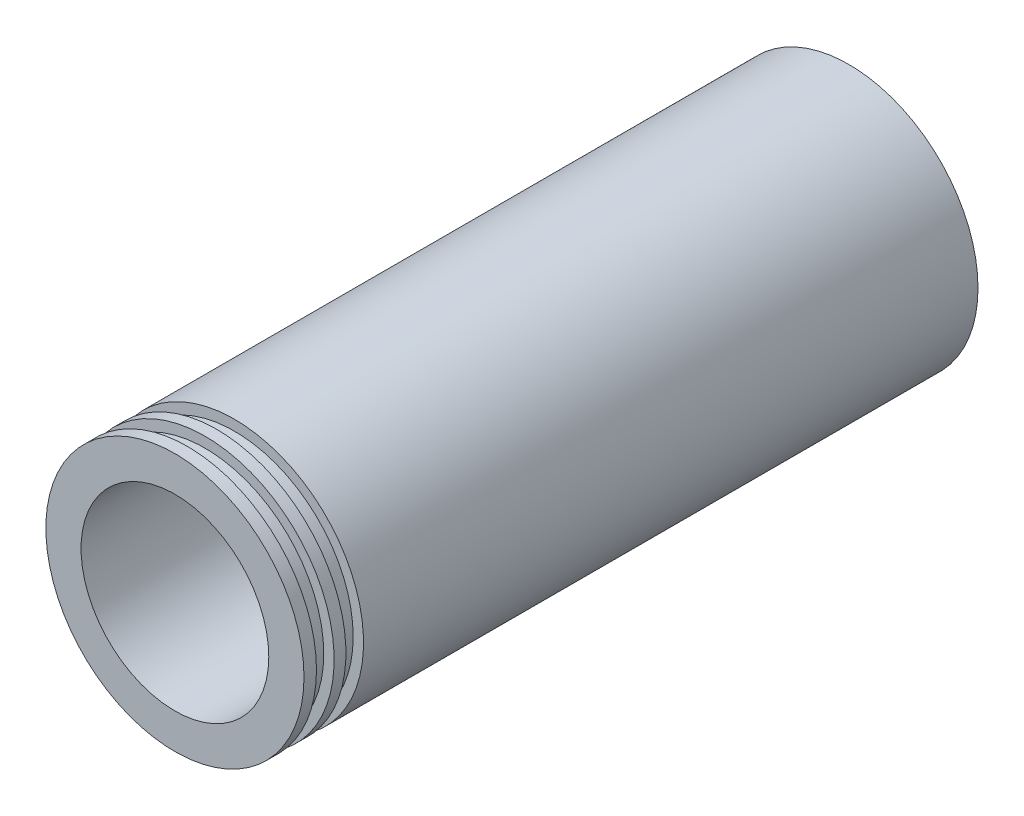
ISO-10303-21;
HEADER;
FILE_DESCRIPTION(('STEP AP214'),'2;1');
FILE_NAME('part.step','',(''),(''),'','','');
FILE_SCHEMA(('AUTOMOTIVE_DESIGN { 1 0 10303 214 1 1 1 1 }'));
ENDSEC;
DATA;
#1=APPLICATION_CONTEXT('core data for automotive mechanical design processes');
#2=APPLICATION_PROTOCOL_DEFINITION('international standard','automotive_design',2000,#1);
#3=PRODUCT_CONTEXT('',#1,'mechanical');
#4=PRODUCT('Part','Part','',(#3));
#5=PRODUCT_RELATED_PRODUCT_CATEGORY('part','',(#4));
#6=PRODUCT_DEFINITION_FORMATION('','',#4);
#7=PRODUCT_DEFINITION_CONTEXT('part definition',#1,'design');
#8=PRODUCT_DEFINITION('design','',#6,#7);
#9=PRODUCT_DEFINITION_SHAPE('','',#8);
#10=(LENGTH_UNIT() NAMED_UNIT(*) SI_UNIT(.MILLI.,.METRE.));
#11=(NAMED_UNIT(*) PLANE_ANGLE_UNIT() SI_UNIT($,.RADIAN.));
#12=(NAMED_UNIT(*) SI_UNIT($,.STERADIAN.) SOLID_ANGLE_UNIT());
#13=UNCERTAINTY_MEASURE_WITH_UNIT(LENGTH_MEASURE(1.E-05),#10,'distance_accuracy_value','');
#14=(GEOMETRIC_REPRESENTATION_CONTEXT(3) GLOBAL_UNCERTAINTY_ASSIGNED_CONTEXT((#13)) GLOBAL_UNIT_ASSIGNED_CONTEXT((#10,
#11,#12)) REPRESENTATION_CONTEXT('',''));
#15=CARTESIAN_POINT('',(0.,0.,0.));
#16=DIRECTION('',(0.,0.,1.));
#17=DIRECTION('',(1.,0.,0.));
#18=AXIS2_PLACEMENT_3D('',#15,#16,#17);
#19=CARTESIAN_POINT('',(0.,0.,182.372));
#20=DIRECTION('',(0.,0.,-1.));
#21=DIRECTION('',(-1.,0.,0.));
#22=AXIS2_PLACEMENT_3D('',#19,#20,#21);
#23=CYLINDRICAL_SURFACE('',#22,34.925);
#24=CARTESIAN_POINT('',(0.,0.,178.99390368949));
#25=DIRECTION('',(0.,0.,1.));
#26=DIRECTION('',(1.,0.,0.));
#27=AXIS2_PLACEMENT_3D('',#24,#25,#26);
#28=CIRCLE('',#27,34.925);
#29=CARTESIAN_POINT('',(34.925,0.,178.99390368949));
#30=VERTEX_POINT('',#29);
#31=EDGE_CURVE('E35',#30,#30,#28,.T.);
#32=ORIENTED_EDGE('',*,*,#31,.T.);
#33=EDGE_LOOP('',(#32));
#34=FACE_BOUND('',#33,.T.);
#35=CARTESIAN_POINT('',(0.,0.,182.372));
#36=DIRECTION('',(0.,0.,1.));
#37=DIRECTION('',(1.,0.,0.));
#38=AXIS2_PLACEMENT_3D('',#35,#36,#37);
#39=CIRCLE('',#38,34.925);
#40=CARTESIAN_POINT('',(34.925,0.,182.372));
#41=VERTEX_POINT('',#40);
#42=EDGE_CURVE('E10',#41,#41,#39,.T.);
#43=ORIENTED_EDGE('',*,*,#42,.F.);
#44=EDGE_LOOP('',(#43));
#45=FACE_BOUND('',#44,.T.);
#46=ADVANCED_FACE('F31',(#34,#45),#23,.T.);
#47=CARTESIAN_POINT('',(0.,0.,182.372));
#48=DIRECTION('',(0.,0.,1.));
#49=DIRECTION('',(1.,0.,0.));
#50=AXIS2_PLACEMENT_3D('',#47,#48,#49);
#51=PLANE('',#50);
#52=ORIENTED_EDGE('',*,*,#42,.T.);
#53=EDGE_LOOP('',(#52));
#54=FACE_BOUND('',#53,.T.);
#55=CARTESIAN_POINT('',(0.,0.,182.372));
#56=DIRECTION('',(0.,0.,1.));
#57=DIRECTION('',(1.,0.,0.));
#58=AXIS2_PLACEMENT_3D('',#55,#56,#57);
#59=CIRCLE('',#58,25.4);
#60=CARTESIAN_POINT('',(25.4,0.,182.372));
#61=VERTEX_POINT('',#60);
#62=EDGE_CURVE('E44',#61,#61,#59,.T.);
#63=ORIENTED_EDGE('',*,*,#62,.F.);
#64=EDGE_LOOP('',(#63));
#65=FACE_BOUND('',#64,.T.);
#66=ADVANCED_FACE('F87',(#54,#65),#51,.T.);
#67=CARTESIAN_POINT('',(0.,0.,0.));
#68=DIRECTION('',(0.,0.,1.));
#69=DIRECTION('',(1.,0.,0.));
#70=AXIS2_PLACEMENT_3D('',#67,#68,#69);
#71=PLANE('',#70);
#72=CARTESIAN_POINT('',(0.,0.,0.));
#73=DIRECTION('',(0.,0.,1.));
#74=DIRECTION('',(1.,0.,0.));
#75=AXIS2_PLACEMENT_3D('',#72,#73,#74);
#76=CIRCLE('',#75,34.925);
#77=CARTESIAN_POINT('',(34.925,0.,0.));
#78=VERTEX_POINT('',#77);
#79=EDGE_CURVE('E39',#78,#78,#76,.T.);
#80=ORIENTED_EDGE('',*,*,#79,.F.);
#81=EDGE_LOOP('',(#80));
#82=FACE_BOUND('',#81,.T.);
#83=CARTESIAN_POINT('',(0.,0.,0.));
#84=DIRECTION('',(0.,0.,1.));
#85=DIRECTION('',(1.,0.,0.));
#86=AXIS2_PLACEMENT_3D('',#83,#84,#85);
#87=CIRCLE('',#86,25.4);
#88=CARTESIAN_POINT('',(25.4,0.,0.));
#89=VERTEX_POINT('',#88);
#90=EDGE_CURVE('E47',#89,#89,#87,.T.);
#91=ORIENTED_EDGE('',*,*,#90,.T.);
#92=EDGE_LOOP('',(#91));
#93=FACE_BOUND('',#92,.T.);
#94=ADVANCED_FACE('F70',(#82,#93),#71,.F.);
#95=CARTESIAN_POINT('',(0.,0.,166.26850368949));
#96=DIRECTION('',(0.,0.,-1.));
#97=DIRECTION('',(-1.,0.,0.));
#98=AXIS2_PLACEMENT_3D('',#95,#96,#97);
#99=CIRCLE('',#98,34.925);
#100=CARTESIAN_POINT('',(-34.925,0.,166.26850368949));
#101=VERTEX_POINT('',#100);
#102=EDGE_CURVE('E49',#101,#101,#99,.T.);
#103=ORIENTED_EDGE('',*,*,#102,.T.);
#104=EDGE_LOOP('',(#103));
#105=FACE_BOUND('',#104,.T.);
#106=ORIENTED_EDGE('',*,*,#79,.T.);
#107=EDGE_LOOP('',(#106));
#108=FACE_BOUND('',#107,.T.);
#109=ADVANCED_FACE('F33',(#105,#108),#23,.T.);
#110=CARTESIAN_POINT('',(0.,0.,182.372));
#111=DIRECTION('',(0.,0.,-1.));
#112=DIRECTION('',(-1.,0.,0.));
#113=AXIS2_PLACEMENT_3D('',#110,#111,#112);
#114=CYLINDRICAL_SURFACE('',#113,25.4);
#115=ORIENTED_EDGE('',*,*,#62,.T.);
#116=EDGE_LOOP('',(#115));
#117=FACE_BOUND('',#116,.T.);
#118=ORIENTED_EDGE('',*,*,#90,.F.);
#119=EDGE_LOOP('',(#118));
#120=FACE_BOUND('',#119,.T.);
#121=ADVANCED_FACE('F72',(#117,#120),#114,.F.);
#122=CARTESIAN_POINT('',(0.,34.925,171.03100368949));
#123=DIRECTION('',(0.,0.,1.));
#124=DIRECTION('',(1.,0.,0.));
#125=AXIS2_PLACEMENT_3D('',#122,#123,#124);
#126=PLANE('',#125);
#127=CARTESIAN_POINT('',(0.,0.,171.03100368949));
#128=DIRECTION('',(0.,0.,-1.));
#129=DIRECTION('',(-1.,0.,0.));
#130=AXIS2_PLACEMENT_3D('',#127,#128,#129);
#131=CIRCLE('',#130,32.131);
#132=CARTESIAN_POINT('',(-32.131,0.,171.03100368949));
#133=VERTEX_POINT('',#132);
#134=EDGE_CURVE('E112',#133,#133,#131,.T.);
#135=ORIENTED_EDGE('',*,*,#134,.F.);
#136=EDGE_LOOP('',(#135));
#137=FACE_BOUND('',#136,.T.);
#138=CARTESIAN_POINT('',(0.,0.,171.03100368949));
#139=DIRECTION('',(0.,0.,-1.));
#140=DIRECTION('',(-1.,0.,0.));
#141=AXIS2_PLACEMENT_3D('',#138,#139,#140);
#142=CIRCLE('',#141,34.925);
#143=CARTESIAN_POINT('',(-34.925,0.,171.03100368949));
#144=VERTEX_POINT('',#143);
#145=EDGE_CURVE('E110',#144,#144,#142,.T.);
#146=ORIENTED_EDGE('',*,*,#145,.T.);
#147=EDGE_LOOP('',(#146));
#148=FACE_BOUND('',#147,.T.);
#149=ADVANCED_FACE('F74',(#137,#148),#126,.F.);
#150=CARTESIAN_POINT('',(0.,0.,171.03100368949));
#151=DIRECTION('',(0.,0.,-1.));
#152=DIRECTION('',(-1.,0.,0.));
#153=AXIS2_PLACEMENT_3D('',#150,#151,#152);
#154=CYLINDRICAL_SURFACE('',#153,32.131);
#155=CARTESIAN_POINT('',(0.,0.,166.26850368949));
#156=DIRECTION('',(0.,0.,-1.));
#157=DIRECTION('',(-1.,0.,0.));
#158=AXIS2_PLACEMENT_3D('',#155,#156,#157);
#159=CIRCLE('',#158,32.131);
#160=CARTESIAN_POINT('',(-32.131,0.,166.26850368949));
#161=VERTEX_POINT('',#160);
#162=EDGE_CURVE('E115',#161,#161,#159,.T.);
#163=ORIENTED_EDGE('',*,*,#162,.F.);
#164=EDGE_LOOP('',(#163));
#165=FACE_BOUND('',#164,.T.);
#166=ORIENTED_EDGE('',*,*,#134,.T.);
#167=EDGE_LOOP('',(#166));
#168=FACE_BOUND('',#167,.T.);
#169=ADVANCED_FACE('F80',(#165,#168),#154,.T.);
#170=CARTESIAN_POINT('',(0.,38.1,166.26850368949));
#171=DIRECTION('',(0.,0.,-1.));
#172=DIRECTION('',(-1.,0.,0.));
#173=AXIS2_PLACEMENT_3D('',#170,#171,#172);
#174=PLANE('',#173);
#175=ORIENTED_EDGE('',*,*,#162,.T.);
#176=EDGE_LOOP('',(#175));
#177=FACE_BOUND('',#176,.T.);
#178=ORIENTED_EDGE('',*,*,#102,.F.);
#179=EDGE_LOOP('',(#178));
#180=FACE_BOUND('',#179,.T.);
#181=ADVANCED_FACE('F95',(#177,#180),#174,.F.);
#182=CARTESIAN_POINT('',(0.,0.,174.21870368949));
#183=DIRECTION('',(0.,0.,-1.));
#184=DIRECTION('',(-1.,0.,0.));
#185=AXIS2_PLACEMENT_3D('',#182,#183,#184);
#186=CIRCLE('',#185,34.925);
#187=CARTESIAN_POINT('',(-34.925,0.,174.21870368949));
#188=VERTEX_POINT('',#187);
#189=EDGE_CURVE('E61',#188,#188,#186,.T.);
#190=ORIENTED_EDGE('',*,*,#189,.T.);
#191=EDGE_LOOP('',(#190));
#192=FACE_BOUND('',#191,.T.);
#193=ORIENTED_EDGE('',*,*,#145,.F.);
#194=EDGE_LOOP('',(#193));
#195=FACE_BOUND('',#194,.T.);
#196=ADVANCED_FACE('F83',(#192,#195),#23,.T.);
#197=CARTESIAN_POINT('',(0.,34.925,178.99390368949));
#198=DIRECTION('',(0.,0.,1.));
#199=DIRECTION('',(1.,0.,0.));
#200=AXIS2_PLACEMENT_3D('',#197,#198,#199);
#201=PLANE('',#200);
#202=CARTESIAN_POINT('',(0.,0.,178.99390368949));
#203=DIRECTION('',(0.,0.,-1.));
#204=DIRECTION('',(-1.,0.,0.));
#205=AXIS2_PLACEMENT_3D('',#202,#203,#204);
#206=CIRCLE('',#205,32.131);
#207=CARTESIAN_POINT('',(-32.131,0.,178.99390368949));
#208=VERTEX_POINT('',#207);
#209=EDGE_CURVE('E51',#208,#208,#206,.T.);
#210=ORIENTED_EDGE('',*,*,#209,.F.);
#211=EDGE_LOOP('',(#210));
#212=FACE_BOUND('',#211,.T.);
#213=ORIENTED_EDGE('',*,*,#31,.F.);
#214=EDGE_LOOP('',(#213));
#215=FACE_BOUND('',#214,.T.);
#216=ADVANCED_FACE('F94',(#212,#215),#201,.F.);
#217=CARTESIAN_POINT('',(0.,0.,171.03100368949));
#218=DIRECTION('',(0.,0.,-1.));
#219=DIRECTION('',(-1.,0.,0.));
#220=AXIS2_PLACEMENT_3D('',#217,#218,#219);
#221=CYLINDRICAL_SURFACE('',#220,32.131);
#222=CARTESIAN_POINT('',(0.,0.,174.23140368949));
#223=DIRECTION('',(0.,0.,-1.));
#224=DIRECTION('',(-1.,0.,0.));
#225=AXIS2_PLACEMENT_3D('',#222,#223,#224);
#226=CIRCLE('',#225,32.131);
#227=CARTESIAN_POINT('',(-32.131,0.,174.23140368949));
#228=VERTEX_POINT('',#227);
#229=EDGE_CURVE('E56',#228,#228,#226,.T.);
#230=ORIENTED_EDGE('',*,*,#229,.F.);
#231=EDGE_LOOP('',(#230));
#232=FACE_BOUND('',#231,.T.);
#233=ORIENTED_EDGE('',*,*,#209,.T.);
#234=EDGE_LOOP('',(#233));
#235=FACE_BOUND('',#234,.T.);
#236=ADVANCED_FACE('F101',(#232,#235),#221,.T.);
#237=CARTESIAN_POINT('',(0.,0.,174.23140368949));
#238=DIRECTION('',(0.,0.,-1.));
#239=DIRECTION('',(-1.,0.,0.));
#240=AXIS2_PLACEMENT_3D('',#237,#238,#239);
#241=CONICAL_SURFACE('',#240,32.131,1.56625090355384);
#242=ORIENTED_EDGE('',*,*,#189,.F.);
#243=EDGE_LOOP('',(#242));
#244=FACE_BOUND('',#243,.T.);
#245=ORIENTED_EDGE('',*,*,#229,.T.);
#246=EDGE_LOOP('',(#245));
#247=FACE_BOUND('',#246,.T.);
#248=ADVANCED_FACE('F129',(#244,#247),#241,.T.);
#249=CLOSED_SHELL('',(#46,#66,#94,#109,#121,#149,#169,#181,#196,#216,#236,#248));
#250=MANIFOLD_SOLID_BREP('B2',#249);
#251=ADVANCED_BREP_SHAPE_REPRESENTATION('',(#18,#250),#14);
#252=SHAPE_DEFINITION_REPRESENTATION(#9,#251);
ENDSEC;
END-ISO-10303-21;
